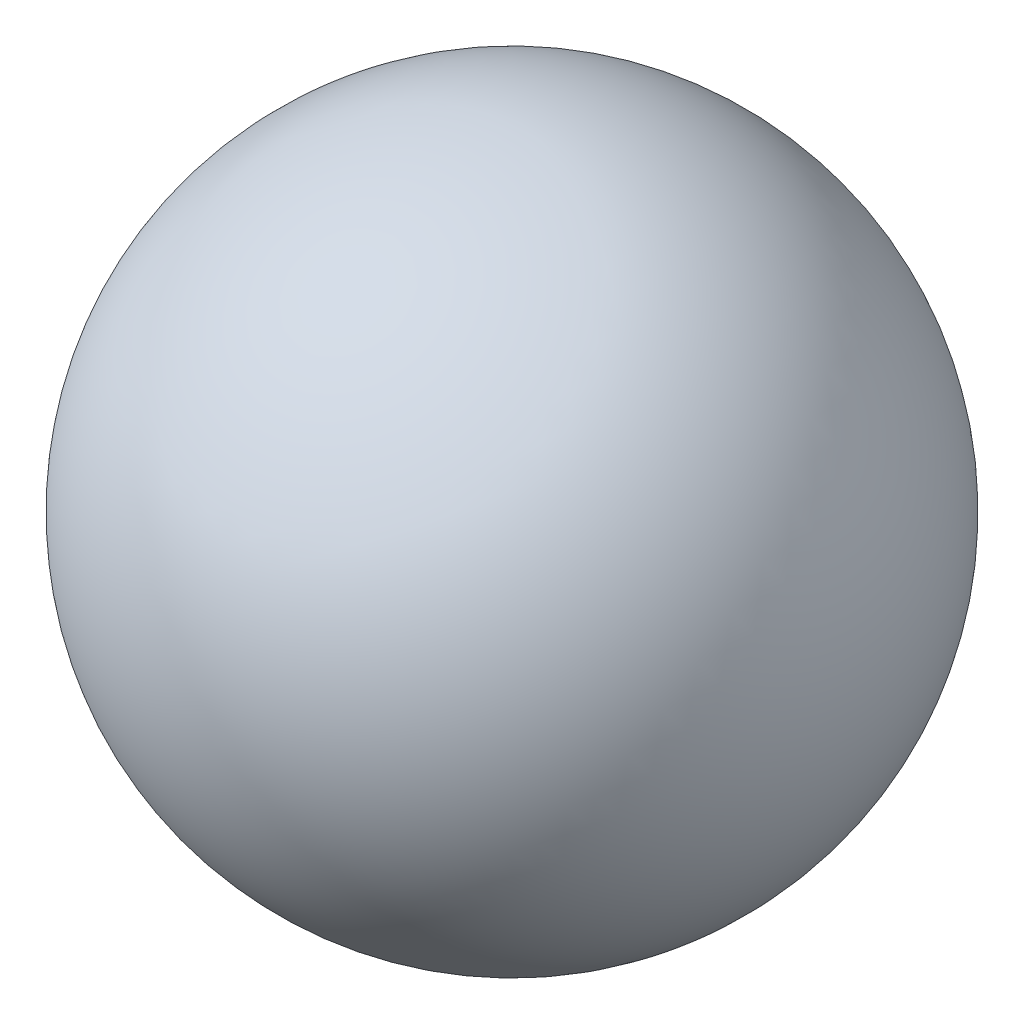
ISO-10303-21;
HEADER;
FILE_DESCRIPTION(('STEP AP214'),'2;1');
FILE_NAME('part.step','',(''),(''),'','','');
FILE_SCHEMA(('AUTOMOTIVE_DESIGN { 1 0 10303 214 1 1 1 1 }'));
ENDSEC;
DATA;
#1=APPLICATION_CONTEXT('core data for automotive mechanical design processes');
#2=APPLICATION_PROTOCOL_DEFINITION('international standard','automotive_design',2000,#1);
#3=PRODUCT_CONTEXT('',#1,'mechanical');
#4=PRODUCT('Part','Part','',(#3));
#5=PRODUCT_RELATED_PRODUCT_CATEGORY('part','',(#4));
#6=PRODUCT_DEFINITION_FORMATION('','',#4);
#7=PRODUCT_DEFINITION_CONTEXT('part definition',#1,'design');
#8=PRODUCT_DEFINITION('design','',#6,#7);
#9=PRODUCT_DEFINITION_SHAPE('','',#8);
#10=(LENGTH_UNIT() NAMED_UNIT(*) SI_UNIT(.MILLI.,.METRE.));
#11=(NAMED_UNIT(*) PLANE_ANGLE_UNIT() SI_UNIT($,.RADIAN.));
#12=(NAMED_UNIT(*) SI_UNIT($,.STERADIAN.) SOLID_ANGLE_UNIT());
#13=UNCERTAINTY_MEASURE_WITH_UNIT(LENGTH_MEASURE(1.E-05),#10,'distance_accuracy_value','');
#14=(GEOMETRIC_REPRESENTATION_CONTEXT(3) GLOBAL_UNCERTAINTY_ASSIGNED_CONTEXT((#13)) GLOBAL_UNIT_ASSIGNED_CONTEXT((#10,
#11,#12)) REPRESENTATION_CONTEXT('',''));
#15=CARTESIAN_POINT('',(0.,0.,0.));
#16=DIRECTION('',(0.,0.,1.));
#17=DIRECTION('',(1.,0.,0.));
#18=AXIS2_PLACEMENT_3D('',#15,#16,#17);
#19=CARTESIAN_POINT('',(-1.98437499999996,3.43703832126952,0.));
#20=DIRECTION('',(-0.499999999999989,0.866025403784445,0.));
#21=DIRECTION('',(-0.866025403784445,-0.499999999999989,0.));
#22=AXIS2_PLACEMENT_3D('',#19,#20,#21);
#23=SPHERICAL_SURFACE('',#22,0.758760243513404);
#24=CARTESIAN_POINT('',(-2.36375512175665,4.0941439675338,0.));
#25=VERTEX_POINT('',#24);
#26=VERTEX_LOOP('',#25);
#27=FACE_BOUND('',#26,.T.);
#28=ADVANCED_FACE('F34',(#27),#23,.T.);
#29=CLOSED_SHELL('',(#28));
#30=MANIFOLD_SOLID_BREP('B2',#29);
#31=ADVANCED_BREP_SHAPE_REPRESENTATION('',(#18,#30),#14);
#32=SHAPE_DEFINITION_REPRESENTATION(#9,#31);
ENDSEC;
END-ISO-10303-21;
